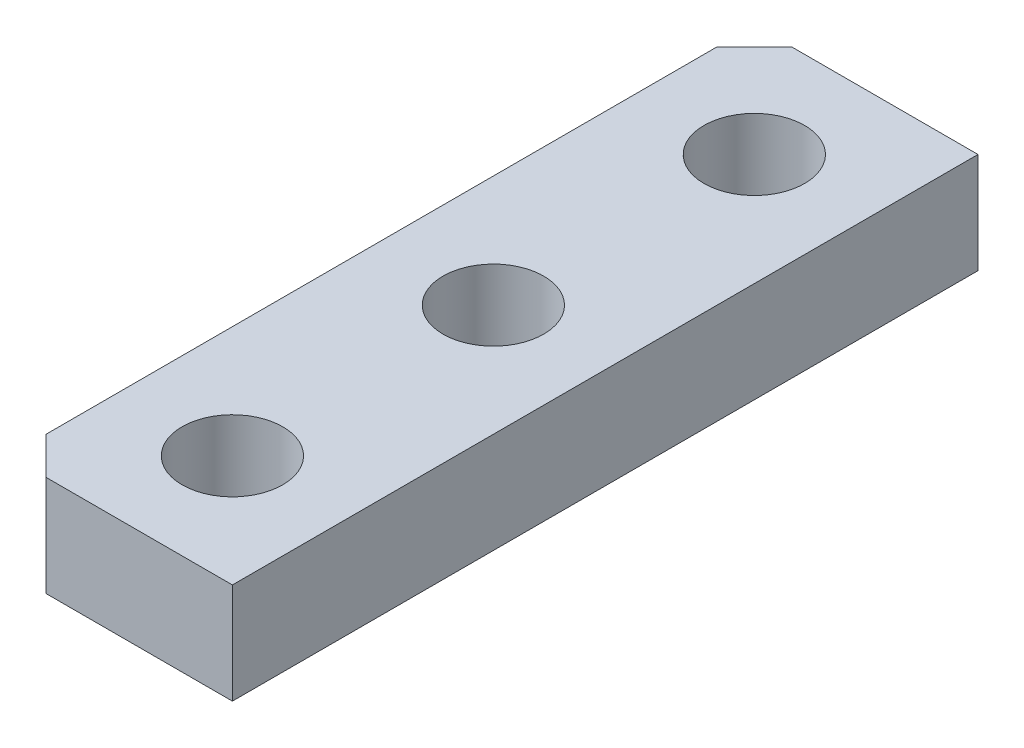
ISO-10303-21;
HEADER;
FILE_DESCRIPTION(('STEP AP214'),'2;1');
FILE_NAME('part.step','',(''),(''),'','','');
FILE_SCHEMA(('AUTOMOTIVE_DESIGN { 1 0 10303 214 1 1 1 1 }'));
ENDSEC;
DATA;
#1=APPLICATION_CONTEXT('core data for automotive mechanical design processes');
#2=APPLICATION_PROTOCOL_DEFINITION('international standard','automotive_design',2000,#1);
#3=PRODUCT_CONTEXT('',#1,'mechanical');
#4=PRODUCT('Part','Part','',(#3));
#5=PRODUCT_RELATED_PRODUCT_CATEGORY('part','',(#4));
#6=PRODUCT_DEFINITION_FORMATION('','',#4);
#7=PRODUCT_DEFINITION_CONTEXT('part definition',#1,'design');
#8=PRODUCT_DEFINITION('design','',#6,#7);
#9=PRODUCT_DEFINITION_SHAPE('','',#8);
#10=(LENGTH_UNIT() NAMED_UNIT(*) SI_UNIT(.MILLI.,.METRE.));
#11=(NAMED_UNIT(*) PLANE_ANGLE_UNIT() SI_UNIT($,.RADIAN.));
#12=(NAMED_UNIT(*) SI_UNIT($,.STERADIAN.) SOLID_ANGLE_UNIT());
#13=UNCERTAINTY_MEASURE_WITH_UNIT(LENGTH_MEASURE(1.E-05),#10,'distance_accuracy_value','');
#14=(GEOMETRIC_REPRESENTATION_CONTEXT(3) GLOBAL_UNCERTAINTY_ASSIGNED_CONTEXT((#13)) GLOBAL_UNIT_ASSIGNED_CONTEXT((#10,
#11,#12)) REPRESENTATION_CONTEXT('',''));
#15=CARTESIAN_POINT('',(0.,0.,0.));
#16=DIRECTION('',(0.,0.,1.));
#17=DIRECTION('',(1.,0.,0.));
#18=AXIS2_PLACEMENT_3D('',#15,#16,#17);
#19=CARTESIAN_POINT('',(-15.,13.5,50.));
#20=DIRECTION('',(1.,0.,0.));
#21=DIRECTION('',(0.,0.,-1.));
#22=AXIS2_PLACEMENT_3D('',#19,#20,#21);
#23=PLANE('',#22);
#24=DIRECTION('',(0.,0.,1.));
#25=VECTOR('',#24,1.);
#26=CARTESIAN_POINT('',(-15.,0.,50.));
#27=LINE('',#26,#25);
#28=CARTESIAN_POINT('',(-15.,0.,-45.));
#29=VERTEX_POINT('',#28);
#30=CARTESIAN_POINT('',(-15.,0.,45.));
#31=VERTEX_POINT('',#30);
#32=EDGE_CURVE('E132',#29,#31,#27,.T.);
#33=ORIENTED_EDGE('',*,*,#32,.T.);
#34=DIRECTION('',(0.,1.,0.));
#35=VECTOR('',#34,1.);
#36=CARTESIAN_POINT('',(-15.,13.5,45.));
#37=LINE('',#36,#35);
#38=CARTESIAN_POINT('',(-15.,13.5,45.));
#39=VERTEX_POINT('',#38);
#40=EDGE_CURVE('E66',#31,#39,#37,.T.);
#41=ORIENTED_EDGE('',*,*,#40,.T.);
#42=DIRECTION('',(0.,0.,1.));
#43=VECTOR('',#42,1.);
#44=CARTESIAN_POINT('',(-15.,13.5,50.));
#45=LINE('',#44,#43);
#46=CARTESIAN_POINT('',(-15.,13.5,-45.));
#47=VERTEX_POINT('',#46);
#48=EDGE_CURVE('E110',#47,#39,#45,.T.);
#49=ORIENTED_EDGE('',*,*,#48,.F.);
#50=DIRECTION('',(0.,-1.,0.));
#51=VECTOR('',#50,1.);
#52=CARTESIAN_POINT('',(-15.,13.5,-45.));
#53=LINE('',#52,#51);
#54=EDGE_CURVE('E154',#47,#29,#53,.T.);
#55=ORIENTED_EDGE('',*,*,#54,.T.);
#56=EDGE_LOOP('',(#33,#41,#49,#55));
#57=FACE_BOUND('',#56,.T.);
#58=ADVANCED_FACE('F43',(#57),#23,.F.);
#59=CARTESIAN_POINT('',(15.,13.5,50.));
#60=DIRECTION('',(0.,0.,-1.));
#61=DIRECTION('',(-1.,0.,0.));
#62=AXIS2_PLACEMENT_3D('',#59,#60,#61);
#63=PLANE('',#62);
#64=DIRECTION('',(1.,0.,0.));
#65=VECTOR('',#64,1.);
#66=CARTESIAN_POINT('',(15.,13.5,50.));
#67=LINE('',#66,#65);
#68=CARTESIAN_POINT('',(-10.,13.5,50.));
#69=VERTEX_POINT('',#68);
#70=CARTESIAN_POINT('',(15.,13.5,50.));
#71=VERTEX_POINT('',#70);
#72=EDGE_CURVE('E99',#69,#71,#67,.T.);
#73=ORIENTED_EDGE('',*,*,#72,.F.);
#74=DIRECTION('',(0.,-1.,0.));
#75=VECTOR('',#74,1.);
#76=CARTESIAN_POINT('',(-10.,13.5,50.));
#77=LINE('',#76,#75);
#78=CARTESIAN_POINT('',(-10.,0.,50.));
#79=VERTEX_POINT('',#78);
#80=EDGE_CURVE('E120',#69,#79,#77,.T.);
#81=ORIENTED_EDGE('',*,*,#80,.T.);
#82=DIRECTION('',(1.,0.,0.));
#83=VECTOR('',#82,1.);
#84=CARTESIAN_POINT('',(15.,0.,50.));
#85=LINE('',#84,#83);
#86=CARTESIAN_POINT('',(15.,0.,50.));
#87=VERTEX_POINT('',#86);
#88=EDGE_CURVE('E116',#79,#87,#85,.T.);
#89=ORIENTED_EDGE('',*,*,#88,.T.);
#90=DIRECTION('',(0.,-1.,0.));
#91=VECTOR('',#90,1.);
#92=CARTESIAN_POINT('',(15.,13.5,50.));
#93=LINE('',#92,#91);
#94=EDGE_CURVE('E113',#71,#87,#93,.T.);
#95=ORIENTED_EDGE('',*,*,#94,.F.);
#96=EDGE_LOOP('',(#73,#81,#89,#95));
#97=FACE_BOUND('',#96,.T.);
#98=ADVANCED_FACE('F114',(#97),#63,.F.);
#99=CARTESIAN_POINT('',(15.,13.5,50.));
#100=DIRECTION('',(-1.,0.,0.));
#101=DIRECTION('',(0.,0.,1.));
#102=AXIS2_PLACEMENT_3D('',#99,#100,#101);
#103=PLANE('',#102);
#104=DIRECTION('',(0.,0.,-1.));
#105=VECTOR('',#104,1.);
#106=CARTESIAN_POINT('',(15.,0.,50.));
#107=LINE('',#106,#105);
#108=CARTESIAN_POINT('',(15.,0.,-50.));
#109=VERTEX_POINT('',#108);
#110=EDGE_CURVE('E138',#87,#109,#107,.T.);
#111=ORIENTED_EDGE('',*,*,#110,.T.);
#112=DIRECTION('',(0.,-1.,0.));
#113=VECTOR('',#112,1.);
#114=CARTESIAN_POINT('',(15.,13.5,-50.));
#115=LINE('',#114,#113);
#116=CARTESIAN_POINT('',(15.,13.5,-50.));
#117=VERTEX_POINT('',#116);
#118=EDGE_CURVE('E121',#117,#109,#115,.T.);
#119=ORIENTED_EDGE('',*,*,#118,.F.);
#120=DIRECTION('',(0.,0.,-1.));
#121=VECTOR('',#120,1.);
#122=CARTESIAN_POINT('',(15.,13.5,50.));
#123=LINE('',#122,#121);
#124=EDGE_CURVE('E103',#71,#117,#123,.T.);
#125=ORIENTED_EDGE('',*,*,#124,.F.);
#126=ORIENTED_EDGE('',*,*,#94,.T.);
#127=EDGE_LOOP('',(#111,#119,#125,#126));
#128=FACE_BOUND('',#127,.T.);
#129=ADVANCED_FACE('F123',(#128),#103,.F.);
#130=CARTESIAN_POINT('',(15.,13.5,-50.));
#131=DIRECTION('',(0.,0.,1.));
#132=DIRECTION('',(1.,0.,0.));
#133=AXIS2_PLACEMENT_3D('',#130,#131,#132);
#134=PLANE('',#133);
#135=DIRECTION('',(-1.,0.,0.));
#136=VECTOR('',#135,1.);
#137=CARTESIAN_POINT('',(15.,0.,-50.));
#138=LINE('',#137,#136);
#139=CARTESIAN_POINT('',(-9.99999999999999,0.,-50.));
#140=VERTEX_POINT('',#139);
#141=EDGE_CURVE('E141',#109,#140,#138,.T.);
#142=ORIENTED_EDGE('',*,*,#141,.T.);
#143=DIRECTION('',(0.,1.,0.));
#144=VECTOR('',#143,1.);
#145=CARTESIAN_POINT('',(-9.99999999999999,13.5,-50.));
#146=LINE('',#145,#144);
#147=CARTESIAN_POINT('',(-9.99999999999999,13.5,-50.));
#148=VERTEX_POINT('',#147);
#149=EDGE_CURVE('E11',#140,#148,#146,.T.);
#150=ORIENTED_EDGE('',*,*,#149,.T.);
#151=DIRECTION('',(-1.,0.,0.));
#152=VECTOR('',#151,1.);
#153=CARTESIAN_POINT('',(15.,13.5,-50.));
#154=LINE('',#153,#152);
#155=EDGE_CURVE('E126',#117,#148,#154,.T.);
#156=ORIENTED_EDGE('',*,*,#155,.F.);
#157=ORIENTED_EDGE('',*,*,#118,.T.);
#158=EDGE_LOOP('',(#142,#150,#156,#157));
#159=FACE_BOUND('',#158,.T.);
#160=ADVANCED_FACE('F171',(#159),#134,.F.);
#161=CARTESIAN_POINT('',(0.,13.5,0.));
#162=DIRECTION('',(0.,1.,0.));
#163=DIRECTION('',(0.,0.,1.));
#164=AXIS2_PLACEMENT_3D('',#161,#162,#163);
#165=PLANE('',#164);
#166=CARTESIAN_POINT('',(0.,13.5,-35.));
#167=DIRECTION('',(0.,1.,0.));
#168=DIRECTION('',(0.,0.,1.));
#169=AXIS2_PLACEMENT_3D('',#166,#167,#168);
#170=CIRCLE('',#169,6.74999999999999);
#171=CARTESIAN_POINT('',(0.,13.5,-28.25));
#172=VERTEX_POINT('',#171);
#173=EDGE_CURVE('E241',#172,#172,#170,.T.);
#174=ORIENTED_EDGE('',*,*,#173,.F.);
#175=EDGE_LOOP('',(#174));
#176=FACE_BOUND('',#175,.T.);
#177=CARTESIAN_POINT('',(0.,13.5,35.));
#178=DIRECTION('',(0.,1.,0.));
#179=DIRECTION('',(0.,0.,1.));
#180=AXIS2_PLACEMENT_3D('',#177,#178,#179);
#181=CIRCLE('',#180,6.74999999999999);
#182=CARTESIAN_POINT('',(0.,13.5,41.75));
#183=VERTEX_POINT('',#182);
#184=EDGE_CURVE('E235',#183,#183,#181,.T.);
#185=ORIENTED_EDGE('',*,*,#184,.F.);
#186=EDGE_LOOP('',(#185));
#187=FACE_BOUND('',#186,.T.);
#188=CARTESIAN_POINT('',(0.,13.5,0.));
#189=DIRECTION('',(0.,1.,0.));
#190=DIRECTION('',(0.,0.,1.));
#191=AXIS2_PLACEMENT_3D('',#188,#189,#190);
#192=CIRCLE('',#191,6.74999999999999);
#193=CARTESIAN_POINT('',(0.,13.5,6.74999999999999));
#194=VERTEX_POINT('',#193);
#195=EDGE_CURVE('E227',#194,#194,#192,.T.);
#196=ORIENTED_EDGE('',*,*,#195,.F.);
#197=EDGE_LOOP('',(#196));
#198=FACE_BOUND('',#197,.T.);
#199=ORIENTED_EDGE('',*,*,#48,.T.);
#200=DIRECTION('',(-0.707106781186547,0.,-0.707106781186549));
#201=VECTOR('',#200,1.);
#202=CARTESIAN_POINT('',(-30.,13.5,29.9999999999999));
#203=LINE('',#202,#201);
#204=EDGE_CURVE('E53',#39,#69,#203,.F.);
#205=ORIENTED_EDGE('',*,*,#204,.T.);
#206=ORIENTED_EDGE('',*,*,#72,.T.);
#207=ORIENTED_EDGE('',*,*,#124,.T.);
#208=ORIENTED_EDGE('',*,*,#155,.T.);
#209=DIRECTION('',(0.70710678118655,0.,-0.707106781186546));
#210=VECTOR('',#209,1.);
#211=CARTESIAN_POINT('',(-30.,13.5,-30.0000000000001));
#212=LINE('',#211,#210);
#213=EDGE_CURVE('E160',#148,#47,#212,.F.);
#214=ORIENTED_EDGE('',*,*,#213,.T.);
#215=EDGE_LOOP('',(#199,#205,#206,#207,#208,#214));
#216=FACE_BOUND('',#215,.T.);
#217=ADVANCED_FACE('F101',(#176,#187,#198,#216),#165,.T.);
#218=CARTESIAN_POINT('',(0.,0.,0.));
#219=DIRECTION('',(0.,1.,0.));
#220=DIRECTION('',(0.,0.,1.));
#221=AXIS2_PLACEMENT_3D('',#218,#219,#220);
#222=PLANE('',#221);
#223=CARTESIAN_POINT('',(0.,0.,-35.));
#224=DIRECTION('',(0.,1.,0.));
#225=DIRECTION('',(0.,0.,1.));
#226=AXIS2_PLACEMENT_3D('',#223,#224,#225);
#227=CIRCLE('',#226,6.74999999999999);
#228=CARTESIAN_POINT('',(0.,0.,-28.25));
#229=VERTEX_POINT('',#228);
#230=EDGE_CURVE('E219',#229,#229,#227,.T.);
#231=ORIENTED_EDGE('',*,*,#230,.T.);
#232=EDGE_LOOP('',(#231));
#233=FACE_BOUND('',#232,.T.);
#234=CARTESIAN_POINT('',(0.,0.,35.));
#235=DIRECTION('',(0.,1.,0.));
#236=DIRECTION('',(0.,0.,1.));
#237=AXIS2_PLACEMENT_3D('',#234,#235,#236);
#238=CIRCLE('',#237,6.74999999999999);
#239=CARTESIAN_POINT('',(0.,0.,41.75));
#240=VERTEX_POINT('',#239);
#241=EDGE_CURVE('E223',#240,#240,#238,.T.);
#242=ORIENTED_EDGE('',*,*,#241,.T.);
#243=EDGE_LOOP('',(#242));
#244=FACE_BOUND('',#243,.T.);
#245=CARTESIAN_POINT('',(0.,0.,0.));
#246=DIRECTION('',(0.,1.,0.));
#247=DIRECTION('',(0.,0.,1.));
#248=AXIS2_PLACEMENT_3D('',#245,#246,#247);
#249=CIRCLE('',#248,6.74999999999999);
#250=CARTESIAN_POINT('',(0.,0.,6.74999999999999));
#251=VERTEX_POINT('',#250);
#252=EDGE_CURVE('E135',#251,#251,#249,.T.);
#253=ORIENTED_EDGE('',*,*,#252,.T.);
#254=EDGE_LOOP('',(#253));
#255=FACE_BOUND('',#254,.T.);
#256=ORIENTED_EDGE('',*,*,#88,.F.);
#257=DIRECTION('',(0.707106781186547,0.,0.707106781186549));
#258=VECTOR('',#257,1.);
#259=CARTESIAN_POINT('',(-10.,0.,50.));
#260=LINE('',#259,#258);
#261=EDGE_CURVE('E151',#79,#31,#260,.F.);
#262=ORIENTED_EDGE('',*,*,#261,.T.);
#263=ORIENTED_EDGE('',*,*,#32,.F.);
#264=DIRECTION('',(-0.70710678118655,0.,0.707106781186546));
#265=VECTOR('',#264,1.);
#266=CARTESIAN_POINT('',(-15.,0.,-45.));
#267=LINE('',#266,#265);
#268=EDGE_CURVE('E148',#29,#140,#267,.F.);
#269=ORIENTED_EDGE('',*,*,#268,.T.);
#270=ORIENTED_EDGE('',*,*,#141,.F.);
#271=ORIENTED_EDGE('',*,*,#110,.F.);
#272=EDGE_LOOP('',(#256,#262,#263,#269,#270,#271));
#273=FACE_BOUND('',#272,.T.);
#274=ADVANCED_FACE('F170',(#233,#244,#255,#273),#222,.F.);
#275=CARTESIAN_POINT('',(0.,13.5,0.));
#276=DIRECTION('',(0.,1.,0.));
#277=DIRECTION('',(0.,0.,1.));
#278=AXIS2_PLACEMENT_3D('',#275,#276,#277);
#279=CYLINDRICAL_SURFACE('',#278,6.74999999999999);
#280=ORIENTED_EDGE('',*,*,#252,.F.);
#281=EDGE_LOOP('',(#280));
#282=FACE_BOUND('',#281,.T.);
#283=ORIENTED_EDGE('',*,*,#195,.T.);
#284=EDGE_LOOP('',(#283));
#285=FACE_BOUND('',#284,.T.);
#286=ADVANCED_FACE('F205',(#282,#285),#279,.F.);
#287=CARTESIAN_POINT('',(0.,13.5,35.));
#288=DIRECTION('',(0.,1.,0.));
#289=DIRECTION('',(0.,0.,1.));
#290=AXIS2_PLACEMENT_3D('',#287,#288,#289);
#291=CYLINDRICAL_SURFACE('',#290,6.74999999999999);
#292=ORIENTED_EDGE('',*,*,#241,.F.);
#293=EDGE_LOOP('',(#292));
#294=FACE_BOUND('',#293,.T.);
#295=ORIENTED_EDGE('',*,*,#184,.T.);
#296=EDGE_LOOP('',(#295));
#297=FACE_BOUND('',#296,.T.);
#298=ADVANCED_FACE('F199',(#294,#297),#291,.F.);
#299=CARTESIAN_POINT('',(0.,13.5,-35.));
#300=DIRECTION('',(0.,1.,0.));
#301=DIRECTION('',(0.,0.,1.));
#302=AXIS2_PLACEMENT_3D('',#299,#300,#301);
#303=CYLINDRICAL_SURFACE('',#302,6.74999999999999);
#304=ORIENTED_EDGE('',*,*,#230,.F.);
#305=EDGE_LOOP('',(#304));
#306=FACE_BOUND('',#305,.T.);
#307=ORIENTED_EDGE('',*,*,#173,.T.);
#308=EDGE_LOOP('',(#307));
#309=FACE_BOUND('',#308,.T.);
#310=ADVANCED_FACE('F193',(#306,#309),#303,.F.);
#311=CARTESIAN_POINT('',(-10.,13.5,50.));
#312=DIRECTION('',(0.707106781186549,0.,-0.707106781186547));
#313=DIRECTION('',(0.,-1.,0.));
#314=AXIS2_PLACEMENT_3D('',#311,#312,#313);
#315=PLANE('',#314);
#316=ORIENTED_EDGE('',*,*,#204,.F.);
#317=ORIENTED_EDGE('',*,*,#40,.F.);
#318=ORIENTED_EDGE('',*,*,#261,.F.);
#319=ORIENTED_EDGE('',*,*,#80,.F.);
#320=EDGE_LOOP('',(#316,#317,#318,#319));
#321=FACE_BOUND('',#320,.T.);
#322=ADVANCED_FACE('F189',(#321),#315,.F.);
#323=CARTESIAN_POINT('',(-15.,13.5,-45.));
#324=DIRECTION('',(0.707106781186545,0.,0.707106781186549));
#325=DIRECTION('',(0.,-1.,0.));
#326=AXIS2_PLACEMENT_3D('',#323,#324,#325);
#327=PLANE('',#326);
#328=ORIENTED_EDGE('',*,*,#213,.F.);
#329=ORIENTED_EDGE('',*,*,#149,.F.);
#330=ORIENTED_EDGE('',*,*,#268,.F.);
#331=ORIENTED_EDGE('',*,*,#54,.F.);
#332=EDGE_LOOP('',(#328,#329,#330,#331));
#333=FACE_BOUND('',#332,.T.);
#334=ADVANCED_FACE('F46',(#333),#327,.F.);
#335=CLOSED_SHELL('',(#58,#98,#129,#160,#217,#274,#286,#298,#310,#322,#334));
#336=MANIFOLD_SOLID_BREP('B2',#335);
#337=ADVANCED_BREP_SHAPE_REPRESENTATION('',(#18,#336),#14);
#338=SHAPE_DEFINITION_REPRESENTATION(#9,#337);
ENDSEC;
END-ISO-10303-21;
